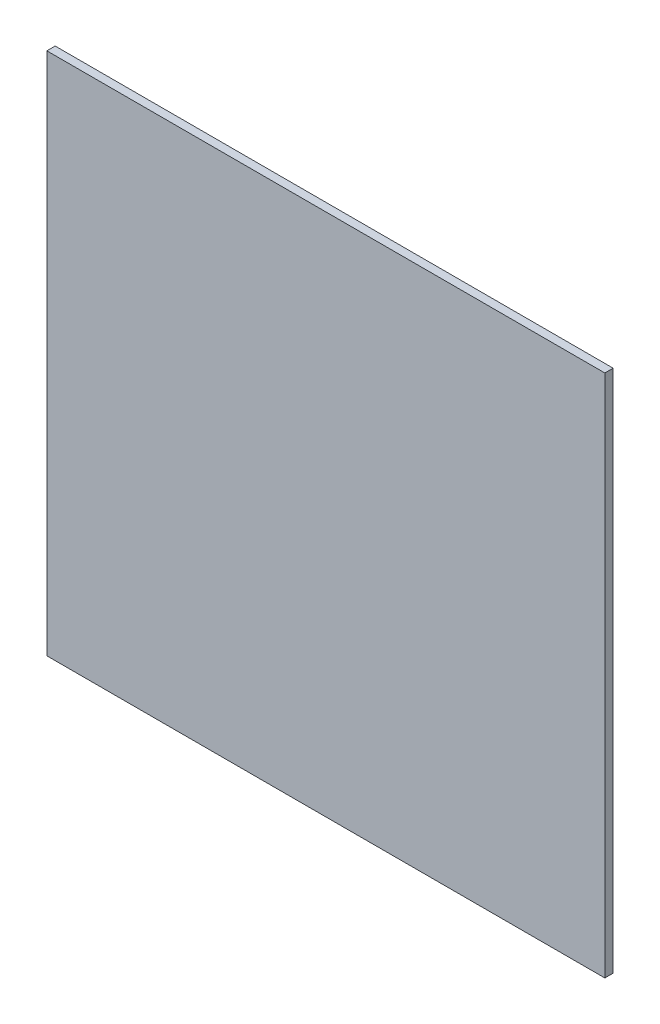
ISO-10303-21;
HEADER;
FILE_DESCRIPTION(('STEP AP214'),'2;1');
FILE_NAME('part.step','',(''),(''),'','','');
FILE_SCHEMA(('AUTOMOTIVE_DESIGN { 1 0 10303 214 1 1 1 1 }'));
ENDSEC;
DATA;
#1=APPLICATION_CONTEXT('core data for automotive mechanical design processes');
#2=APPLICATION_PROTOCOL_DEFINITION('international standard','automotive_design',2000,#1);
#3=PRODUCT_CONTEXT('',#1,'mechanical');
#4=PRODUCT('Part','Part','',(#3));
#5=PRODUCT_RELATED_PRODUCT_CATEGORY('part','',(#4));
#6=PRODUCT_DEFINITION_FORMATION('','',#4);
#7=PRODUCT_DEFINITION_CONTEXT('part definition',#1,'design');
#8=PRODUCT_DEFINITION('design','',#6,#7);
#9=PRODUCT_DEFINITION_SHAPE('','',#8);
#10=(LENGTH_UNIT() NAMED_UNIT(*) SI_UNIT(.MILLI.,.METRE.));
#11=(NAMED_UNIT(*) PLANE_ANGLE_UNIT() SI_UNIT($,.RADIAN.));
#12=(NAMED_UNIT(*) SI_UNIT($,.STERADIAN.) SOLID_ANGLE_UNIT());
#13=UNCERTAINTY_MEASURE_WITH_UNIT(LENGTH_MEASURE(1.E-05),#10,'distance_accuracy_value','');
#14=(GEOMETRIC_REPRESENTATION_CONTEXT(3) GLOBAL_UNCERTAINTY_ASSIGNED_CONTEXT((#13)) GLOBAL_UNIT_ASSIGNED_CONTEXT((#10,
#11,#12)) REPRESENTATION_CONTEXT('',''));
#15=CARTESIAN_POINT('',(0.,0.,0.));
#16=DIRECTION('',(0.,0.,1.));
#17=DIRECTION('',(1.,0.,0.));
#18=AXIS2_PLACEMENT_3D('',#15,#16,#17);
#19=CARTESIAN_POINT('',(-106.5,100.,3.175));
#20=DIRECTION('',(1.,0.,0.));
#21=DIRECTION('',(0.,1.,0.));
#22=AXIS2_PLACEMENT_3D('',#19,#20,#21);
#23=PLANE('',#22);
#24=DIRECTION('',(0.,-1.,0.));
#25=VECTOR('',#24,1.);
#26=CARTESIAN_POINT('',(-106.5,100.,0.));
#27=LINE('',#26,#25);
#28=CARTESIAN_POINT('',(-106.5,100.,0.));
#29=VERTEX_POINT('',#28);
#30=CARTESIAN_POINT('',(-106.5,-100.,0.));
#31=VERTEX_POINT('',#30);
#32=EDGE_CURVE('E98',#29,#31,#27,.T.);
#33=ORIENTED_EDGE('',*,*,#32,.T.);
#34=DIRECTION('',(0.,0.,-1.));
#35=VECTOR('',#34,1.);
#36=CARTESIAN_POINT('',(-106.5,-100.,3.175));
#37=LINE('',#36,#35);
#38=CARTESIAN_POINT('',(-106.5,-100.,3.175));
#39=VERTEX_POINT('',#38);
#40=EDGE_CURVE('E11',#39,#31,#37,.T.);
#41=ORIENTED_EDGE('',*,*,#40,.F.);
#42=DIRECTION('',(0.,-1.,0.));
#43=VECTOR('',#42,1.);
#44=CARTESIAN_POINT('',(-106.5,100.,3.175));
#45=LINE('',#44,#43);
#46=CARTESIAN_POINT('',(-106.5,100.,3.175));
#47=VERTEX_POINT('',#46);
#48=EDGE_CURVE('E86',#47,#39,#45,.T.);
#49=ORIENTED_EDGE('',*,*,#48,.F.);
#50=DIRECTION('',(0.,0.,-1.));
#51=VECTOR('',#50,1.);
#52=CARTESIAN_POINT('',(-106.5,100.,3.175));
#53=LINE('',#52,#51);
#54=EDGE_CURVE('E94',#47,#29,#53,.T.);
#55=ORIENTED_EDGE('',*,*,#54,.T.);
#56=EDGE_LOOP('',(#33,#41,#49,#55));
#57=FACE_BOUND('',#56,.T.);
#58=ADVANCED_FACE('F35',(#57),#23,.F.);
#59=CARTESIAN_POINT('',(-106.5,-100.,3.175));
#60=DIRECTION('',(0.,1.,0.));
#61=DIRECTION('',(0.,0.,1.));
#62=AXIS2_PLACEMENT_3D('',#59,#60,#61);
#63=PLANE('',#62);
#64=DIRECTION('',(1.,0.,0.));
#65=VECTOR('',#64,1.);
#66=CARTESIAN_POINT('',(-106.5,-100.,0.));
#67=LINE('',#66,#65);
#68=CARTESIAN_POINT('',(106.5,-100.,0.));
#69=VERTEX_POINT('',#68);
#70=EDGE_CURVE('E90',#31,#69,#67,.T.);
#71=ORIENTED_EDGE('',*,*,#70,.T.);
#72=DIRECTION('',(0.,0.,-1.));
#73=VECTOR('',#72,1.);
#74=CARTESIAN_POINT('',(106.5,-100.,3.175));
#75=LINE('',#74,#73);
#76=CARTESIAN_POINT('',(106.5,-100.,3.175));
#77=VERTEX_POINT('',#76);
#78=EDGE_CURVE('E43',#77,#69,#75,.T.);
#79=ORIENTED_EDGE('',*,*,#78,.F.);
#80=DIRECTION('',(1.,0.,0.));
#81=VECTOR('',#80,1.);
#82=CARTESIAN_POINT('',(-106.5,-100.,3.175));
#83=LINE('',#82,#81);
#84=EDGE_CURVE('E81',#39,#77,#83,.T.);
#85=ORIENTED_EDGE('',*,*,#84,.F.);
#86=ORIENTED_EDGE('',*,*,#40,.T.);
#87=EDGE_LOOP('',(#71,#79,#85,#86));
#88=FACE_BOUND('',#87,.T.);
#89=ADVANCED_FACE('F89',(#88),#63,.F.);
#90=CARTESIAN_POINT('',(106.5,100.,3.175));
#91=DIRECTION('',(-1.,0.,0.));
#92=DIRECTION('',(0.,-1.,0.));
#93=AXIS2_PLACEMENT_3D('',#90,#91,#92);
#94=PLANE('',#93);
#95=DIRECTION('',(0.,1.,0.));
#96=VECTOR('',#95,1.);
#97=CARTESIAN_POINT('',(106.5,100.,0.));
#98=LINE('',#97,#96);
#99=CARTESIAN_POINT('',(106.5,100.,0.));
#100=VERTEX_POINT('',#99);
#101=EDGE_CURVE('E68',#69,#100,#98,.T.);
#102=ORIENTED_EDGE('',*,*,#101,.T.);
#103=DIRECTION('',(0.,0.,-1.));
#104=VECTOR('',#103,1.);
#105=CARTESIAN_POINT('',(106.5,100.,3.175));
#106=LINE('',#105,#104);
#107=CARTESIAN_POINT('',(106.5,100.,3.175));
#108=VERTEX_POINT('',#107);
#109=EDGE_CURVE('E91',#108,#100,#106,.T.);
#110=ORIENTED_EDGE('',*,*,#109,.F.);
#111=DIRECTION('',(0.,1.,0.));
#112=VECTOR('',#111,1.);
#113=CARTESIAN_POINT('',(106.5,100.,3.175));
#114=LINE('',#113,#112);
#115=EDGE_CURVE('E84',#77,#108,#114,.T.);
#116=ORIENTED_EDGE('',*,*,#115,.F.);
#117=ORIENTED_EDGE('',*,*,#78,.T.);
#118=EDGE_LOOP('',(#102,#110,#116,#117));
#119=FACE_BOUND('',#118,.T.);
#120=ADVANCED_FACE('F92',(#119),#94,.F.);
#121=CARTESIAN_POINT('',(-106.5,100.,3.175));
#122=DIRECTION('',(0.,-1.,0.));
#123=DIRECTION('',(0.,0.,-1.));
#124=AXIS2_PLACEMENT_3D('',#121,#122,#123);
#125=PLANE('',#124);
#126=DIRECTION('',(-1.,0.,0.));
#127=VECTOR('',#126,1.);
#128=CARTESIAN_POINT('',(-106.5,100.,0.));
#129=LINE('',#128,#127);
#130=EDGE_CURVE('E74',#100,#29,#129,.T.);
#131=ORIENTED_EDGE('',*,*,#130,.T.);
#132=ORIENTED_EDGE('',*,*,#54,.F.);
#133=DIRECTION('',(-1.,0.,0.));
#134=VECTOR('',#133,1.);
#135=CARTESIAN_POINT('',(-106.5,100.,3.175));
#136=LINE('',#135,#134);
#137=EDGE_CURVE('E51',#108,#47,#136,.T.);
#138=ORIENTED_EDGE('',*,*,#137,.F.);
#139=ORIENTED_EDGE('',*,*,#109,.T.);
#140=EDGE_LOOP('',(#131,#132,#138,#139));
#141=FACE_BOUND('',#140,.T.);
#142=ADVANCED_FACE('F105',(#141),#125,.F.);
#143=CARTESIAN_POINT('',(-106.5,-100.,3.175));
#144=DIRECTION('',(0.,0.,1.));
#145=DIRECTION('',(1.,0.,0.));
#146=AXIS2_PLACEMENT_3D('',#143,#144,#145);
#147=PLANE('',#146);
#148=ORIENTED_EDGE('',*,*,#48,.T.);
#149=ORIENTED_EDGE('',*,*,#84,.T.);
#150=ORIENTED_EDGE('',*,*,#115,.T.);
#151=ORIENTED_EDGE('',*,*,#137,.T.);
#152=EDGE_LOOP('',(#148,#149,#150,#151));
#153=FACE_BOUND('',#152,.T.);
#154=ADVANCED_FACE('F82',(#153),#147,.T.);
#155=CARTESIAN_POINT('',(-106.5,-100.,0.));
#156=DIRECTION('',(0.,0.,1.));
#157=DIRECTION('',(1.,0.,0.));
#158=AXIS2_PLACEMENT_3D('',#155,#156,#157);
#159=PLANE('',#158);
#160=ORIENTED_EDGE('',*,*,#32,.F.);
#161=ORIENTED_EDGE('',*,*,#130,.F.);
#162=ORIENTED_EDGE('',*,*,#101,.F.);
#163=ORIENTED_EDGE('',*,*,#70,.F.);
#164=EDGE_LOOP('',(#160,#161,#162,#163));
#165=FACE_BOUND('',#164,.T.);
#166=ADVANCED_FACE('F108',(#165),#159,.F.);
#167=CLOSED_SHELL('',(#58,#89,#120,#142,#154,#166));
#168=MANIFOLD_SOLID_BREP('B2',#167);
#169=ADVANCED_BREP_SHAPE_REPRESENTATION('',(#18,#168),#14);
#170=SHAPE_DEFINITION_REPRESENTATION(#9,#169);
ENDSEC;
END-ISO-10303-21;
